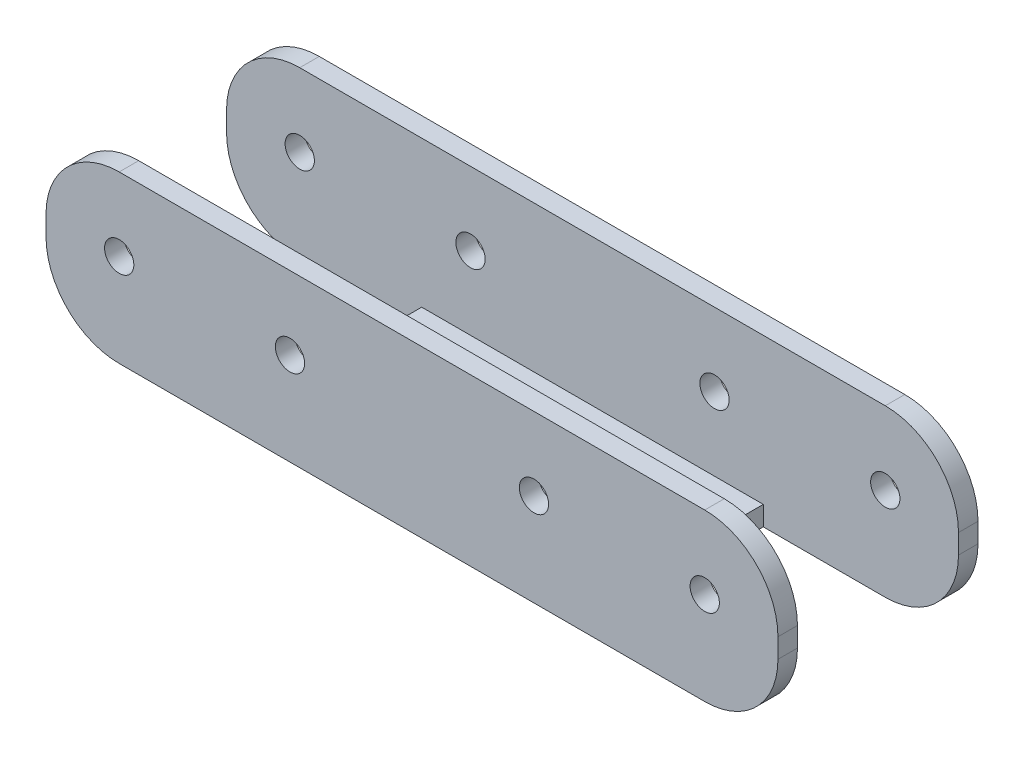
ISO-10303-21;
HEADER;
FILE_DESCRIPTION(('STEP AP214'),'2;1');
FILE_NAME('part.step','',(''),(''),'','','');
FILE_SCHEMA(('AUTOMOTIVE_DESIGN { 1 0 10303 214 1 1 1 1 }'));
ENDSEC;
DATA;
#1=APPLICATION_CONTEXT('core data for automotive mechanical design processes');
#2=APPLICATION_PROTOCOL_DEFINITION('international standard','automotive_design',2000,#1);
#3=PRODUCT_CONTEXT('',#1,'mechanical');
#4=PRODUCT('Part','Part','',(#3));
#5=PRODUCT_RELATED_PRODUCT_CATEGORY('part','',(#4));
#6=PRODUCT_DEFINITION_FORMATION('','',#4);
#7=PRODUCT_DEFINITION_CONTEXT('part definition',#1,'design');
#8=PRODUCT_DEFINITION('design','',#6,#7);
#9=PRODUCT_DEFINITION_SHAPE('','',#8);
#10=(LENGTH_UNIT() NAMED_UNIT(*) SI_UNIT(.MILLI.,.METRE.));
#11=(NAMED_UNIT(*) PLANE_ANGLE_UNIT() SI_UNIT($,.RADIAN.));
#12=(NAMED_UNIT(*) SI_UNIT($,.STERADIAN.) SOLID_ANGLE_UNIT());
#13=UNCERTAINTY_MEASURE_WITH_UNIT(LENGTH_MEASURE(1.E-05),#10,'distance_accuracy_value','');
#14=(GEOMETRIC_REPRESENTATION_CONTEXT(3) GLOBAL_UNCERTAINTY_ASSIGNED_CONTEXT((#13)) GLOBAL_UNIT_ASSIGNED_CONTEXT((#10,
#11,#12)) REPRESENTATION_CONTEXT('',''));
#15=CARTESIAN_POINT('',(0.,0.,0.));
#16=DIRECTION('',(0.,0.,1.));
#17=DIRECTION('',(1.,0.,0.));
#18=AXIS2_PLACEMENT_3D('',#15,#16,#17);
#19=CARTESIAN_POINT('',(0.,0.,0.));
#20=DIRECTION('',(1.,0.,0.));
#21=DIRECTION('',(0.,0.,-1.));
#22=AXIS2_PLACEMENT_3D('',#19,#20,#21);
#23=PLANE('',#22);
#24=DIRECTION('',(0.,-1.,0.));
#25=VECTOR('',#24,1.);
#26=CARTESIAN_POINT('',(0.,0.,-20.5));
#27=LINE('',#26,#25);
#28=CARTESIAN_POINT('',(0.,19.,-20.5));
#29=VERTEX_POINT('',#28);
#30=CARTESIAN_POINT('',(0.,15.,-20.5));
#31=VERTEX_POINT('',#30);
#32=EDGE_CURVE('E269',#29,#31,#27,.T.);
#33=ORIENTED_EDGE('',*,*,#32,.T.);
#34=DIRECTION('',(0.,0.,-1.));
#35=VECTOR('',#34,1.);
#36=CARTESIAN_POINT('',(0.,15.,0.));
#37=LINE('',#36,#35);
#38=CARTESIAN_POINT('',(0.,15.,-16.5));
#39=VERTEX_POINT('',#38);
#40=EDGE_CURVE('E358',#31,#39,#37,.F.);
#41=ORIENTED_EDGE('',*,*,#40,.T.);
#42=DIRECTION('',(0.,1.,0.));
#43=VECTOR('',#42,1.);
#44=CARTESIAN_POINT('',(0.,0.,-16.5));
#45=LINE('',#44,#43);
#46=CARTESIAN_POINT('',(0.,19.,-16.5));
#47=VERTEX_POINT('',#46);
#48=EDGE_CURVE('E255',#39,#47,#45,.T.);
#49=ORIENTED_EDGE('',*,*,#48,.T.);
#50=DIRECTION('',(0.,0.,-1.));
#51=VECTOR('',#50,1.);
#52=CARTESIAN_POINT('',(0.,19.,-20.5));
#53=LINE('',#52,#51);
#54=EDGE_CURVE('E355',#47,#29,#53,.T.);
#55=ORIENTED_EDGE('',*,*,#54,.T.);
#56=EDGE_LOOP('',(#33,#41,#49,#55));
#57=FACE_BOUND('',#56,.T.);
#58=ADVANCED_FACE('F37',(#57),#23,.F.);
#59=CARTESIAN_POINT('',(150.,0.,0.));
#60=DIRECTION('',(1.,0.,0.));
#61=DIRECTION('',(0.,0.,-1.));
#62=AXIS2_PLACEMENT_3D('',#59,#60,#61);
#63=PLANE('',#62);
#64=DIRECTION('',(0.,-1.,0.));
#65=VECTOR('',#64,1.);
#66=CARTESIAN_POINT('',(150.,0.,20.5));
#67=LINE('',#66,#65);
#68=CARTESIAN_POINT('',(150.,19.,20.5));
#69=VERTEX_POINT('',#68);
#70=CARTESIAN_POINT('',(150.,15.,20.5));
#71=VERTEX_POINT('',#70);
#72=EDGE_CURVE('E254',#69,#71,#67,.T.);
#73=ORIENTED_EDGE('',*,*,#72,.T.);
#74=DIRECTION('',(0.,0.,-1.));
#75=VECTOR('',#74,1.);
#76=CARTESIAN_POINT('',(150.,15.,16.5));
#77=LINE('',#76,#75);
#78=CARTESIAN_POINT('',(150.,15.,16.5));
#79=VERTEX_POINT('',#78);
#80=EDGE_CURVE('E299',#71,#79,#77,.T.);
#81=ORIENTED_EDGE('',*,*,#80,.T.);
#82=DIRECTION('',(0.,1.,0.));
#83=VECTOR('',#82,1.);
#84=CARTESIAN_POINT('',(150.,0.,16.5));
#85=LINE('',#84,#83);
#86=CARTESIAN_POINT('',(150.,19.,16.5));
#87=VERTEX_POINT('',#86);
#88=EDGE_CURVE('E251',#79,#87,#85,.T.);
#89=ORIENTED_EDGE('',*,*,#88,.T.);
#90=DIRECTION('',(0.,0.,1.));
#91=VECTOR('',#90,1.);
#92=CARTESIAN_POINT('',(150.,19.,20.5));
#93=LINE('',#92,#91);
#94=EDGE_CURVE('E292',#87,#69,#93,.T.);
#95=ORIENTED_EDGE('',*,*,#94,.T.);
#96=EDGE_LOOP('',(#73,#81,#89,#95));
#97=FACE_BOUND('',#96,.T.);
#98=ADVANCED_FACE('F420',(#97),#63,.T.);
#99=CARTESIAN_POINT('',(150.,4.,0.));
#100=DIRECTION('',(0.,-1.,0.));
#101=DIRECTION('',(0.,0.,-1.));
#102=AXIS2_PLACEMENT_3D('',#99,#100,#101);
#103=PLANE('',#102);
#104=DIRECTION('',(-1.,0.,0.));
#105=VECTOR('',#104,1.);
#106=CARTESIAN_POINT('',(150.,4.,-16.5));
#107=LINE('',#106,#105);
#108=CARTESIAN_POINT('',(110.,4.,-16.5));
#109=VERTEX_POINT('',#108);
#110=CARTESIAN_POINT('',(40.,4.,-16.5));
#111=VERTEX_POINT('',#110);
#112=EDGE_CURVE('E263',#109,#111,#107,.T.);
#113=ORIENTED_EDGE('',*,*,#112,.T.);
#114=DIRECTION('',(0.,0.,1.));
#115=VECTOR('',#114,1.);
#116=CARTESIAN_POINT('',(40.,4.,0.));
#117=LINE('',#116,#115);
#118=CARTESIAN_POINT('',(40.,3.99999999999999,16.5));
#119=VERTEX_POINT('',#118);
#120=EDGE_CURVE('E211',#111,#119,#117,.T.);
#121=ORIENTED_EDGE('',*,*,#120,.T.);
#122=DIRECTION('',(-1.,0.,0.));
#123=VECTOR('',#122,1.);
#124=CARTESIAN_POINT('',(150.,3.99999999999999,16.5));
#125=LINE('',#124,#123);
#126=CARTESIAN_POINT('',(110.,3.99999999999999,16.5));
#127=VERTEX_POINT('',#126);
#128=EDGE_CURVE('E186',#127,#119,#125,.T.);
#129=ORIENTED_EDGE('',*,*,#128,.F.);
#130=DIRECTION('',(0.,0.,-1.));
#131=VECTOR('',#130,1.);
#132=CARTESIAN_POINT('',(110.,4.,0.));
#133=LINE('',#132,#131);
#134=EDGE_CURVE('E225',#127,#109,#133,.T.);
#135=ORIENTED_EDGE('',*,*,#134,.T.);
#136=EDGE_LOOP('',(#113,#121,#129,#135));
#137=FACE_BOUND('',#136,.T.);
#138=ADVANCED_FACE('F425',(#137),#103,.F.);
#139=CARTESIAN_POINT('',(150.,0.,16.5));
#140=DIRECTION('',(0.,0.,1.));
#141=DIRECTION('',(0.,-1.,0.));
#142=AXIS2_PLACEMENT_3D('',#139,#140,#141);
#143=PLANE('',#142);
#144=CARTESIAN_POINT('',(100.,19.,16.5));
#145=DIRECTION('',(0.,0.,1.));
#146=DIRECTION('',(0.,-1.,0.));
#147=AXIS2_PLACEMENT_3D('',#144,#145,#146);
#148=CIRCLE('',#147,3.00000000000001);
#149=CARTESIAN_POINT('',(100.,16.,16.5));
#150=VERTEX_POINT('',#149);
#151=EDGE_CURVE('E372',#150,#150,#148,.T.);
#152=ORIENTED_EDGE('',*,*,#151,.T.);
#153=EDGE_LOOP('',(#152));
#154=FACE_BOUND('',#153,.T.);
#155=CARTESIAN_POINT('',(50.,19.,16.5));
#156=DIRECTION('',(0.,0.,1.));
#157=DIRECTION('',(0.,-1.,0.));
#158=AXIS2_PLACEMENT_3D('',#155,#156,#157);
#159=CIRCLE('',#158,3.);
#160=CARTESIAN_POINT('',(50.,16.,16.5));
#161=VERTEX_POINT('',#160);
#162=EDGE_CURVE('E199',#161,#161,#159,.T.);
#163=ORIENTED_EDGE('',*,*,#162,.T.);
#164=EDGE_LOOP('',(#163));
#165=FACE_BOUND('',#164,.T.);
#166=ORIENTED_EDGE('',*,*,#88,.F.);
#167=CARTESIAN_POINT('',(135.,15.,16.5));
#168=DIRECTION('',(0.,0.,1.));
#169=DIRECTION('',(0.,-1.,0.));
#170=AXIS2_PLACEMENT_3D('',#167,#168,#169);
#171=CIRCLE('',#170,15.);
#172=CARTESIAN_POINT('',(135.,0.,16.5));
#173=VERTEX_POINT('',#172);
#174=EDGE_CURVE('E308',#79,#173,#171,.F.);
#175=ORIENTED_EDGE('',*,*,#174,.T.);
#176=DIRECTION('',(-1.,0.,0.));
#177=VECTOR('',#176,1.);
#178=CARTESIAN_POINT('',(110.,0.,16.5));
#179=LINE('',#178,#177);
#180=CARTESIAN_POINT('',(110.,0.,16.5));
#181=VERTEX_POINT('',#180);
#182=EDGE_CURVE('E214',#173,#181,#179,.T.);
#183=ORIENTED_EDGE('',*,*,#182,.T.);
#184=DIRECTION('',(0.,-1.,0.));
#185=VECTOR('',#184,1.);
#186=CARTESIAN_POINT('',(110.,10.,16.5));
#187=LINE('',#186,#185);
#188=EDGE_CURVE('E222',#127,#181,#187,.T.);
#189=ORIENTED_EDGE('',*,*,#188,.F.);
#190=ORIENTED_EDGE('',*,*,#128,.T.);
#191=DIRECTION('',(0.,-1.,0.));
#192=VECTOR('',#191,1.);
#193=CARTESIAN_POINT('',(40.,10.,16.5));
#194=LINE('',#193,#192);
#195=CARTESIAN_POINT('',(40.,0.,16.5));
#196=VERTEX_POINT('',#195);
#197=EDGE_CURVE('E177',#119,#196,#194,.T.);
#198=ORIENTED_EDGE('',*,*,#197,.T.);
#199=DIRECTION('',(-1.,0.,0.));
#200=VECTOR('',#199,1.);
#201=CARTESIAN_POINT('',(40.,0.,16.5));
#202=LINE('',#201,#200);
#203=CARTESIAN_POINT('',(15.,0.,16.5));
#204=VERTEX_POINT('',#203);
#205=EDGE_CURVE('E183',#196,#204,#202,.T.);
#206=ORIENTED_EDGE('',*,*,#205,.T.);
#207=CARTESIAN_POINT('',(15.,15.,16.5));
#208=DIRECTION('',(0.,0.,1.));
#209=DIRECTION('',(0.,-1.,0.));
#210=AXIS2_PLACEMENT_3D('',#207,#208,#209);
#211=CIRCLE('',#210,15.);
#212=CARTESIAN_POINT('',(0.,15.,16.5));
#213=VERTEX_POINT('',#212);
#214=EDGE_CURVE('E304',#204,#213,#211,.F.);
#215=ORIENTED_EDGE('',*,*,#214,.T.);
#216=DIRECTION('',(0.,1.,0.));
#217=VECTOR('',#216,1.);
#218=CARTESIAN_POINT('',(0.,0.,16.5));
#219=LINE('',#218,#217);
#220=CARTESIAN_POINT('',(0.,19.,16.5));
#221=VERTEX_POINT('',#220);
#222=EDGE_CURVE('E250',#213,#221,#219,.T.);
#223=ORIENTED_EDGE('',*,*,#222,.T.);
#224=CARTESIAN_POINT('',(15.,19.,16.5));
#225=DIRECTION('',(0.,0.,1.));
#226=DIRECTION('',(0.,-1.,0.));
#227=AXIS2_PLACEMENT_3D('',#224,#225,#226);
#228=CIRCLE('',#227,15.);
#229=CARTESIAN_POINT('',(15.,34.,16.5));
#230=VERTEX_POINT('',#229);
#231=EDGE_CURVE('E302',#221,#230,#228,.F.);
#232=ORIENTED_EDGE('',*,*,#231,.T.);
#233=DIRECTION('',(-1.,0.,0.));
#234=VECTOR('',#233,1.);
#235=CARTESIAN_POINT('',(150.,34.,16.5));
#236=LINE('',#235,#234);
#237=CARTESIAN_POINT('',(135.,34.,16.5));
#238=VERTEX_POINT('',#237);
#239=EDGE_CURVE('E288',#238,#230,#236,.T.);
#240=ORIENTED_EDGE('',*,*,#239,.F.);
#241=CARTESIAN_POINT('',(135.,19.,16.5));
#242=DIRECTION('',(0.,0.,1.));
#243=DIRECTION('',(0.,-1.,0.));
#244=AXIS2_PLACEMENT_3D('',#241,#242,#243);
#245=CIRCLE('',#244,15.);
#246=EDGE_CURVE('E306',#238,#87,#245,.F.);
#247=ORIENTED_EDGE('',*,*,#246,.T.);
#248=EDGE_LOOP('',(#166,#175,#183,#189,#190,#198,#206,#215,#223,#232,#240,#247));
#249=FACE_BOUND('',#248,.T.);
#250=CARTESIAN_POINT('',(135.,19.,16.5));
#251=DIRECTION('',(0.,0.,1.));
#252=DIRECTION('',(0.,-1.,0.));
#253=AXIS2_PLACEMENT_3D('',#250,#251,#252);
#254=CIRCLE('',#253,2.99999999999999);
#255=CARTESIAN_POINT('',(135.,16.,16.5));
#256=VERTEX_POINT('',#255);
#257=EDGE_CURVE('E237',#256,#256,#254,.T.);
#258=ORIENTED_EDGE('',*,*,#257,.T.);
#259=EDGE_LOOP('',(#258));
#260=FACE_BOUND('',#259,.T.);
#261=CARTESIAN_POINT('',(15.,19.,16.5));
#262=DIRECTION('',(0.,0.,1.));
#263=DIRECTION('',(0.,-1.,0.));
#264=AXIS2_PLACEMENT_3D('',#261,#262,#263);
#265=CIRCLE('',#264,2.99999999999999);
#266=CARTESIAN_POINT('',(15.,16.,16.5));
#267=VERTEX_POINT('',#266);
#268=EDGE_CURVE('E247',#267,#267,#265,.T.);
#269=ORIENTED_EDGE('',*,*,#268,.T.);
#270=EDGE_LOOP('',(#269));
#271=FACE_BOUND('',#270,.T.);
#272=ADVANCED_FACE('F180',(#154,#165,#249,#260,#271),#143,.F.);
#273=CARTESIAN_POINT('',(150.,34.,0.));
#274=DIRECTION('',(0.,-1.,0.));
#275=DIRECTION('',(0.,0.,-1.));
#276=AXIS2_PLACEMENT_3D('',#273,#274,#275);
#277=PLANE('',#276);
#278=DIRECTION('',(-1.,0.,0.));
#279=VECTOR('',#278,1.);
#280=CARTESIAN_POINT('',(150.,34.,20.5));
#281=LINE('',#280,#279);
#282=CARTESIAN_POINT('',(135.,34.,20.5));
#283=VERTEX_POINT('',#282);
#284=CARTESIAN_POINT('',(15.,34.,20.5));
#285=VERTEX_POINT('',#284);
#286=EDGE_CURVE('E285',#283,#285,#281,.T.);
#287=ORIENTED_EDGE('',*,*,#286,.F.);
#288=DIRECTION('',(0.,0.,1.));
#289=VECTOR('',#288,1.);
#290=CARTESIAN_POINT('',(135.,34.,16.5));
#291=LINE('',#290,#289);
#292=EDGE_CURVE('E353',#283,#238,#291,.F.);
#293=ORIENTED_EDGE('',*,*,#292,.T.);
#294=ORIENTED_EDGE('',*,*,#239,.T.);
#295=DIRECTION('',(0.,0.,1.));
#296=VECTOR('',#295,1.);
#297=CARTESIAN_POINT('',(15.,34.,0.));
#298=LINE('',#297,#296);
#299=EDGE_CURVE('E350',#230,#285,#298,.T.);
#300=ORIENTED_EDGE('',*,*,#299,.T.);
#301=EDGE_LOOP('',(#287,#293,#294,#300));
#302=FACE_BOUND('',#301,.T.);
#303=ADVANCED_FACE('F438',(#302),#277,.F.);
#304=CARTESIAN_POINT('',(150.,0.,20.5));
#305=DIRECTION('',(0.,0.,-1.));
#306=DIRECTION('',(0.,1.,0.));
#307=AXIS2_PLACEMENT_3D('',#304,#305,#306);
#308=PLANE('',#307);
#309=CARTESIAN_POINT('',(100.,19.,20.5));
#310=DIRECTION('',(0.,0.,1.));
#311=DIRECTION('',(1.,0.,0.));
#312=AXIS2_PLACEMENT_3D('',#309,#310,#311);
#313=CIRCLE('',#312,3.00000000000001);
#314=CARTESIAN_POINT('',(103.,19.,20.5));
#315=VERTEX_POINT('',#314);
#316=EDGE_CURVE('E377',#315,#315,#313,.T.);
#317=ORIENTED_EDGE('',*,*,#316,.F.);
#318=EDGE_LOOP('',(#317));
#319=FACE_BOUND('',#318,.T.);
#320=CARTESIAN_POINT('',(50.,19.,20.5));
#321=DIRECTION('',(0.,0.,1.));
#322=DIRECTION('',(1.,0.,0.));
#323=AXIS2_PLACEMENT_3D('',#320,#321,#322);
#324=CIRCLE('',#323,3.);
#325=CARTESIAN_POINT('',(53.,19.,20.5));
#326=VERTEX_POINT('',#325);
#327=EDGE_CURVE('E367',#326,#326,#324,.T.);
#328=ORIENTED_EDGE('',*,*,#327,.F.);
#329=EDGE_LOOP('',(#328));
#330=FACE_BOUND('',#329,.T.);
#331=CARTESIAN_POINT('',(135.,19.,20.5));
#332=DIRECTION('',(0.,0.,1.));
#333=DIRECTION('',(-1.,0.,0.));
#334=AXIS2_PLACEMENT_3D('',#331,#332,#333);
#335=CIRCLE('',#334,2.99999999999999);
#336=CARTESIAN_POINT('',(132.,19.,20.5));
#337=VERTEX_POINT('',#336);
#338=EDGE_CURVE('E230',#337,#337,#335,.T.);
#339=ORIENTED_EDGE('',*,*,#338,.F.);
#340=EDGE_LOOP('',(#339));
#341=FACE_BOUND('',#340,.T.);
#342=CARTESIAN_POINT('',(15.,19.,20.5));
#343=DIRECTION('',(0.,0.,1.));
#344=DIRECTION('',(1.,0.,0.));
#345=AXIS2_PLACEMENT_3D('',#342,#343,#344);
#346=CIRCLE('',#345,2.99999999999999);
#347=CARTESIAN_POINT('',(18.,19.,20.5));
#348=VERTEX_POINT('',#347);
#349=EDGE_CURVE('E240',#348,#348,#346,.T.);
#350=ORIENTED_EDGE('',*,*,#349,.F.);
#351=EDGE_LOOP('',(#350));
#352=FACE_BOUND('',#351,.T.);
#353=DIRECTION('',(-1.,0.,0.));
#354=VECTOR('',#353,1.);
#355=CARTESIAN_POINT('',(150.,0.,20.5));
#356=LINE('',#355,#354);
#357=CARTESIAN_POINT('',(135.,0.,20.5));
#358=VERTEX_POINT('',#357);
#359=CARTESIAN_POINT('',(15.,0.,20.5));
#360=VERTEX_POINT('',#359);
#361=EDGE_CURVE('E283',#358,#360,#356,.T.);
#362=ORIENTED_EDGE('',*,*,#361,.F.);
#363=CARTESIAN_POINT('',(135.,15.,20.5));
#364=DIRECTION('',(0.,0.,-1.));
#365=DIRECTION('',(0.,1.,0.));
#366=AXIS2_PLACEMENT_3D('',#363,#364,#365);
#367=CIRCLE('',#366,15.);
#368=EDGE_CURVE('E324',#358,#71,#367,.F.);
#369=ORIENTED_EDGE('',*,*,#368,.T.);
#370=ORIENTED_EDGE('',*,*,#72,.F.);
#371=CARTESIAN_POINT('',(135.,19.,20.5));
#372=DIRECTION('',(0.,0.,-1.));
#373=DIRECTION('',(0.,1.,0.));
#374=AXIS2_PLACEMENT_3D('',#371,#372,#373);
#375=CIRCLE('',#374,15.);
#376=EDGE_CURVE('E322',#69,#283,#375,.F.);
#377=ORIENTED_EDGE('',*,*,#376,.T.);
#378=ORIENTED_EDGE('',*,*,#286,.T.);
#379=CARTESIAN_POINT('',(15.,19.,20.5));
#380=DIRECTION('',(0.,0.,-1.));
#381=DIRECTION('',(0.,1.,0.));
#382=AXIS2_PLACEMENT_3D('',#379,#380,#381);
#383=CIRCLE('',#382,15.);
#384=CARTESIAN_POINT('',(0.,19.,20.5));
#385=VERTEX_POINT('',#384);
#386=EDGE_CURVE('E318',#285,#385,#383,.F.);
#387=ORIENTED_EDGE('',*,*,#386,.T.);
#388=DIRECTION('',(0.,-1.,0.));
#389=VECTOR('',#388,1.);
#390=CARTESIAN_POINT('',(0.,0.,20.5));
#391=LINE('',#390,#389);
#392=CARTESIAN_POINT('',(0.,15.,20.5));
#393=VERTEX_POINT('',#392);
#394=EDGE_CURVE('E266',#385,#393,#391,.T.);
#395=ORIENTED_EDGE('',*,*,#394,.T.);
#396=CARTESIAN_POINT('',(15.,15.,20.5));
#397=DIRECTION('',(0.,0.,-1.));
#398=DIRECTION('',(0.,1.,0.));
#399=AXIS2_PLACEMENT_3D('',#396,#397,#398);
#400=CIRCLE('',#399,15.);
#401=EDGE_CURVE('E320',#393,#360,#400,.F.);
#402=ORIENTED_EDGE('',*,*,#401,.T.);
#403=EDGE_LOOP('',(#362,#369,#370,#377,#378,#387,#395,#402));
#404=FACE_BOUND('',#403,.T.);
#405=ADVANCED_FACE('F435',(#319,#330,#341,#352,#404),#308,.F.);
#406=CARTESIAN_POINT('',(150.,0.,0.));
#407=DIRECTION('',(0.,1.,0.));
#408=DIRECTION('',(0.,0.,1.));
#409=AXIS2_PLACEMENT_3D('',#406,#407,#408);
#410=PLANE('',#409);
#411=ORIENTED_EDGE('',*,*,#182,.F.);
#412=DIRECTION('',(0.,0.,-1.));
#413=VECTOR('',#412,1.);
#414=CARTESIAN_POINT('',(135.,0.,20.5));
#415=LINE('',#414,#413);
#416=EDGE_CURVE('E316',#173,#358,#415,.F.);
#417=ORIENTED_EDGE('',*,*,#416,.T.);
#418=ORIENTED_EDGE('',*,*,#361,.T.);
#419=DIRECTION('',(0.,0.,-1.));
#420=VECTOR('',#419,1.);
#421=CARTESIAN_POINT('',(15.,0.,0.));
#422=LINE('',#421,#420);
#423=EDGE_CURVE('E206',#360,#204,#422,.T.);
#424=ORIENTED_EDGE('',*,*,#423,.T.);
#425=ORIENTED_EDGE('',*,*,#205,.F.);
#426=DIRECTION('',(0.,0.,1.));
#427=VECTOR('',#426,1.);
#428=CARTESIAN_POINT('',(40.,0.,-16.5));
#429=LINE('',#428,#427);
#430=CARTESIAN_POINT('',(40.,0.,-16.5));
#431=VERTEX_POINT('',#430);
#432=EDGE_CURVE('E194',#431,#196,#429,.T.);
#433=ORIENTED_EDGE('',*,*,#432,.F.);
#434=DIRECTION('',(1.,0.,0.));
#435=VECTOR('',#434,1.);
#436=CARTESIAN_POINT('',(0.,0.,-16.5));
#437=LINE('',#436,#435);
#438=CARTESIAN_POINT('',(15.,0.,-16.5));
#439=VERTEX_POINT('',#438);
#440=EDGE_CURVE('E190',#439,#431,#437,.T.);
#441=ORIENTED_EDGE('',*,*,#440,.F.);
#442=DIRECTION('',(0.,0.,-1.));
#443=VECTOR('',#442,1.);
#444=CARTESIAN_POINT('',(15.,0.,0.));
#445=LINE('',#444,#443);
#446=CARTESIAN_POINT('',(15.,0.,-20.5));
#447=VERTEX_POINT('',#446);
#448=EDGE_CURVE('E311',#439,#447,#445,.T.);
#449=ORIENTED_EDGE('',*,*,#448,.T.);
#450=DIRECTION('',(-1.,0.,0.));
#451=VECTOR('',#450,1.);
#452=CARTESIAN_POINT('',(150.,0.,-20.5));
#453=LINE('',#452,#451);
#454=CARTESIAN_POINT('',(135.,0.,-20.5));
#455=VERTEX_POINT('',#454);
#456=EDGE_CURVE('E280',#455,#447,#453,.T.);
#457=ORIENTED_EDGE('',*,*,#456,.F.);
#458=DIRECTION('',(0.,0.,-1.));
#459=VECTOR('',#458,1.);
#460=CARTESIAN_POINT('',(135.,0.,-16.5));
#461=LINE('',#460,#459);
#462=CARTESIAN_POINT('',(135.,0.,-16.5));
#463=VERTEX_POINT('',#462);
#464=EDGE_CURVE('E314',#455,#463,#461,.F.);
#465=ORIENTED_EDGE('',*,*,#464,.T.);
#466=DIRECTION('',(1.,0.,0.));
#467=VECTOR('',#466,1.);
#468=CARTESIAN_POINT('',(150.,0.,-16.5));
#469=LINE('',#468,#467);
#470=CARTESIAN_POINT('',(110.,0.,-16.5));
#471=VERTEX_POINT('',#470);
#472=EDGE_CURVE('E219',#471,#463,#469,.T.);
#473=ORIENTED_EDGE('',*,*,#472,.F.);
#474=DIRECTION('',(0.,0.,-1.));
#475=VECTOR('',#474,1.);
#476=CARTESIAN_POINT('',(110.,0.,-16.5));
#477=LINE('',#476,#475);
#478=EDGE_CURVE('E216',#181,#471,#477,.T.);
#479=ORIENTED_EDGE('',*,*,#478,.F.);
#480=EDGE_LOOP('',(#411,#417,#418,#424,#425,#433,#441,#449,#457,#465,#473,#479));
#481=FACE_BOUND('',#480,.T.);
#482=ADVANCED_FACE('F203',(#481),#410,.F.);
#483=CARTESIAN_POINT('',(150.,0.,-20.5));
#484=DIRECTION('',(0.,0.,-1.));
#485=DIRECTION('',(0.,1.,0.));
#486=AXIS2_PLACEMENT_3D('',#483,#484,#485);
#487=PLANE('',#486);
#488=CARTESIAN_POINT('',(100.,19.,-20.5));
#489=DIRECTION('',(0.,0.,1.));
#490=DIRECTION('',(1.,0.,0.));
#491=AXIS2_PLACEMENT_3D('',#488,#489,#490);
#492=CIRCLE('',#491,3.00000000000001);
#493=CARTESIAN_POINT('',(103.,19.,-20.5));
#494=VERTEX_POINT('',#493);
#495=EDGE_CURVE('E380',#494,#494,#492,.T.);
#496=ORIENTED_EDGE('',*,*,#495,.T.);
#497=EDGE_LOOP('',(#496));
#498=FACE_BOUND('',#497,.T.);
#499=CARTESIAN_POINT('',(50.,19.,-20.5));
#500=DIRECTION('',(0.,0.,1.));
#501=DIRECTION('',(1.,0.,0.));
#502=AXIS2_PLACEMENT_3D('',#499,#500,#501);
#503=CIRCLE('',#502,3.);
#504=CARTESIAN_POINT('',(53.,19.,-20.5));
#505=VERTEX_POINT('',#504);
#506=EDGE_CURVE('E362',#505,#505,#503,.T.);
#507=ORIENTED_EDGE('',*,*,#506,.T.);
#508=EDGE_LOOP('',(#507));
#509=FACE_BOUND('',#508,.T.);
#510=CARTESIAN_POINT('',(135.,19.,-20.5));
#511=DIRECTION('',(0.,0.,-1.));
#512=DIRECTION('',(0.,1.,0.));
#513=AXIS2_PLACEMENT_3D('',#510,#511,#512);
#514=CIRCLE('',#513,2.99999999999999);
#515=CARTESIAN_POINT('',(135.,22.,-20.5));
#516=VERTEX_POINT('',#515);
#517=EDGE_CURVE('E234',#516,#516,#514,.T.);
#518=ORIENTED_EDGE('',*,*,#517,.F.);
#519=EDGE_LOOP('',(#518));
#520=FACE_BOUND('',#519,.T.);
#521=CARTESIAN_POINT('',(15.,19.,-20.5));
#522=DIRECTION('',(0.,0.,-1.));
#523=DIRECTION('',(0.,1.,0.));
#524=AXIS2_PLACEMENT_3D('',#521,#522,#523);
#525=CIRCLE('',#524,2.99999999999999);
#526=CARTESIAN_POINT('',(15.,22.,-20.5));
#527=VERTEX_POINT('',#526);
#528=EDGE_CURVE('E244',#527,#527,#525,.T.);
#529=ORIENTED_EDGE('',*,*,#528,.F.);
#530=EDGE_LOOP('',(#529));
#531=FACE_BOUND('',#530,.T.);
#532=DIRECTION('',(0.,-1.,0.));
#533=VECTOR('',#532,1.);
#534=CARTESIAN_POINT('',(150.,0.,-20.5));
#535=LINE('',#534,#533);
#536=CARTESIAN_POINT('',(150.,19.,-20.5));
#537=VERTEX_POINT('',#536);
#538=CARTESIAN_POINT('',(150.,15.,-20.5));
#539=VERTEX_POINT('',#538);
#540=EDGE_CURVE('E258',#537,#539,#535,.T.);
#541=ORIENTED_EDGE('',*,*,#540,.T.);
#542=CARTESIAN_POINT('',(135.,15.,-20.5));
#543=DIRECTION('',(0.,0.,-1.));
#544=DIRECTION('',(0.,1.,0.));
#545=AXIS2_PLACEMENT_3D('',#542,#543,#544);
#546=CIRCLE('',#545,15.);
#547=EDGE_CURVE('E337',#539,#455,#546,.T.);
#548=ORIENTED_EDGE('',*,*,#547,.T.);
#549=ORIENTED_EDGE('',*,*,#456,.T.);
#550=CARTESIAN_POINT('',(15.,15.,-20.5));
#551=DIRECTION('',(0.,0.,-1.));
#552=DIRECTION('',(0.,1.,0.));
#553=AXIS2_PLACEMENT_3D('',#550,#551,#552);
#554=CIRCLE('',#553,15.);
#555=EDGE_CURVE('E333',#447,#31,#554,.T.);
#556=ORIENTED_EDGE('',*,*,#555,.T.);
#557=ORIENTED_EDGE('',*,*,#32,.F.);
#558=CARTESIAN_POINT('',(15.,19.,-20.5));
#559=DIRECTION('',(0.,0.,-1.));
#560=DIRECTION('',(0.,1.,0.));
#561=AXIS2_PLACEMENT_3D('',#558,#559,#560);
#562=CIRCLE('',#561,15.);
#563=CARTESIAN_POINT('',(15.,34.,-20.5));
#564=VERTEX_POINT('',#563);
#565=EDGE_CURVE('E331',#29,#564,#562,.T.);
#566=ORIENTED_EDGE('',*,*,#565,.T.);
#567=DIRECTION('',(-1.,0.,0.));
#568=VECTOR('',#567,1.);
#569=CARTESIAN_POINT('',(150.,34.,-20.5));
#570=LINE('',#569,#568);
#571=CARTESIAN_POINT('',(135.,34.,-20.5));
#572=VERTEX_POINT('',#571);
#573=EDGE_CURVE('E278',#572,#564,#570,.T.);
#574=ORIENTED_EDGE('',*,*,#573,.F.);
#575=CARTESIAN_POINT('',(135.,19.,-20.5));
#576=DIRECTION('',(0.,0.,-1.));
#577=DIRECTION('',(0.,1.,0.));
#578=AXIS2_PLACEMENT_3D('',#575,#576,#577);
#579=CIRCLE('',#578,15.);
#580=EDGE_CURVE('E335',#572,#537,#579,.T.);
#581=ORIENTED_EDGE('',*,*,#580,.T.);
#582=EDGE_LOOP('',(#541,#548,#549,#556,#557,#566,#574,#581));
#583=FACE_BOUND('',#582,.T.);
#584=ADVANCED_FACE('F430',(#498,#509,#520,#531,#583),#487,.T.);
#585=CARTESIAN_POINT('',(150.,34.,0.));
#586=DIRECTION('',(0.,1.,0.));
#587=DIRECTION('',(0.,0.,1.));
#588=AXIS2_PLACEMENT_3D('',#585,#586,#587);
#589=PLANE('',#588);
#590=DIRECTION('',(-1.,0.,0.));
#591=VECTOR('',#590,1.);
#592=CARTESIAN_POINT('',(150.,34.,-16.5));
#593=LINE('',#592,#591);
#594=CARTESIAN_POINT('',(135.,34.,-16.5));
#595=VERTEX_POINT('',#594);
#596=CARTESIAN_POINT('',(15.,34.,-16.5));
#597=VERTEX_POINT('',#596);
#598=EDGE_CURVE('E276',#595,#597,#593,.T.);
#599=ORIENTED_EDGE('',*,*,#598,.F.);
#600=DIRECTION('',(0.,0.,-1.));
#601=VECTOR('',#600,1.);
#602=CARTESIAN_POINT('',(135.,34.,0.));
#603=LINE('',#602,#601);
#604=EDGE_CURVE('E347',#595,#572,#603,.T.);
#605=ORIENTED_EDGE('',*,*,#604,.T.);
#606=ORIENTED_EDGE('',*,*,#573,.T.);
#607=DIRECTION('',(0.,0.,-1.));
#608=VECTOR('',#607,1.);
#609=CARTESIAN_POINT('',(15.,34.,-16.5));
#610=LINE('',#609,#608);
#611=EDGE_CURVE('E54',#564,#597,#610,.F.);
#612=ORIENTED_EDGE('',*,*,#611,.T.);
#613=EDGE_LOOP('',(#599,#605,#606,#612));
#614=FACE_BOUND('',#613,.T.);
#615=ADVANCED_FACE('F394',(#614),#589,.T.);
#616=CARTESIAN_POINT('',(150.,0.,-16.5));
#617=DIRECTION('',(0.,0.,1.));
#618=DIRECTION('',(0.,-1.,0.));
#619=AXIS2_PLACEMENT_3D('',#616,#617,#618);
#620=PLANE('',#619);
#621=CARTESIAN_POINT('',(100.,19.,-16.5));
#622=DIRECTION('',(0.,0.,1.));
#623=DIRECTION('',(0.,-1.,0.));
#624=AXIS2_PLACEMENT_3D('',#621,#622,#623);
#625=CIRCLE('',#624,3.00000000000001);
#626=CARTESIAN_POINT('',(100.,16.,-16.5));
#627=VERTEX_POINT('',#626);
#628=EDGE_CURVE('E41',#627,#627,#625,.T.);
#629=ORIENTED_EDGE('',*,*,#628,.F.);
#630=EDGE_LOOP('',(#629));
#631=FACE_BOUND('',#630,.T.);
#632=CARTESIAN_POINT('',(50.,19.,-16.5));
#633=DIRECTION('',(0.,0.,1.));
#634=DIRECTION('',(0.,-1.,0.));
#635=AXIS2_PLACEMENT_3D('',#632,#633,#634);
#636=CIRCLE('',#635,3.);
#637=CARTESIAN_POINT('',(50.,16.,-16.5));
#638=VERTEX_POINT('',#637);
#639=EDGE_CURVE('E360',#638,#638,#636,.T.);
#640=ORIENTED_EDGE('',*,*,#639,.F.);
#641=EDGE_LOOP('',(#640));
#642=FACE_BOUND('',#641,.T.);
#643=ORIENTED_EDGE('',*,*,#472,.T.);
#644=CARTESIAN_POINT('',(135.,15.,-16.5));
#645=DIRECTION('',(0.,0.,1.));
#646=DIRECTION('',(0.,-1.,0.));
#647=AXIS2_PLACEMENT_3D('',#644,#645,#646);
#648=CIRCLE('',#647,15.);
#649=CARTESIAN_POINT('',(150.,15.,-16.5));
#650=VERTEX_POINT('',#649);
#651=EDGE_CURVE('E344',#463,#650,#648,.T.);
#652=ORIENTED_EDGE('',*,*,#651,.T.);
#653=DIRECTION('',(0.,1.,0.));
#654=VECTOR('',#653,1.);
#655=CARTESIAN_POINT('',(150.,0.,-16.5));
#656=LINE('',#655,#654);
#657=CARTESIAN_POINT('',(150.,19.,-16.5));
#658=VERTEX_POINT('',#657);
#659=EDGE_CURVE('E261',#650,#658,#656,.T.);
#660=ORIENTED_EDGE('',*,*,#659,.T.);
#661=CARTESIAN_POINT('',(135.,19.,-16.5));
#662=DIRECTION('',(0.,0.,1.));
#663=DIRECTION('',(0.,-1.,0.));
#664=AXIS2_PLACEMENT_3D('',#661,#662,#663);
#665=CIRCLE('',#664,15.);
#666=EDGE_CURVE('E61',#658,#595,#665,.T.);
#667=ORIENTED_EDGE('',*,*,#666,.T.);
#668=ORIENTED_EDGE('',*,*,#598,.T.);
#669=CARTESIAN_POINT('',(15.,19.,-16.5));
#670=DIRECTION('',(0.,0.,1.));
#671=DIRECTION('',(0.,-1.,0.));
#672=AXIS2_PLACEMENT_3D('',#669,#670,#671);
#673=CIRCLE('',#672,15.);
#674=EDGE_CURVE('E339',#597,#47,#673,.T.);
#675=ORIENTED_EDGE('',*,*,#674,.T.);
#676=ORIENTED_EDGE('',*,*,#48,.F.);
#677=CARTESIAN_POINT('',(15.,15.,-16.5));
#678=DIRECTION('',(0.,0.,1.));
#679=DIRECTION('',(0.,-1.,0.));
#680=AXIS2_PLACEMENT_3D('',#677,#678,#679);
#681=CIRCLE('',#680,15.);
#682=EDGE_CURVE('E341',#39,#439,#681,.T.);
#683=ORIENTED_EDGE('',*,*,#682,.T.);
#684=ORIENTED_EDGE('',*,*,#440,.T.);
#685=DIRECTION('',(0.,-1.,0.));
#686=VECTOR('',#685,1.);
#687=CARTESIAN_POINT('',(40.,10.,-16.5));
#688=LINE('',#687,#686);
#689=EDGE_CURVE('E189',#111,#431,#688,.T.);
#690=ORIENTED_EDGE('',*,*,#689,.F.);
#691=ORIENTED_EDGE('',*,*,#112,.F.);
#692=DIRECTION('',(0.,-1.,0.));
#693=VECTOR('',#692,1.);
#694=CARTESIAN_POINT('',(110.,10.,-16.5));
#695=LINE('',#694,#693);
#696=EDGE_CURVE('E223',#109,#471,#695,.T.);
#697=ORIENTED_EDGE('',*,*,#696,.T.);
#698=EDGE_LOOP('',(#643,#652,#660,#667,#668,#675,#676,#683,#684,#690,#691,#697));
#699=FACE_BOUND('',#698,.T.);
#700=CARTESIAN_POINT('',(135.,19.,-16.5));
#701=DIRECTION('',(0.,0.,1.));
#702=DIRECTION('',(0.,-1.,0.));
#703=AXIS2_PLACEMENT_3D('',#700,#701,#702);
#704=CIRCLE('',#703,2.99999999999999);
#705=CARTESIAN_POINT('',(135.,16.,-16.5));
#706=VERTEX_POINT('',#705);
#707=EDGE_CURVE('E233',#706,#706,#704,.T.);
#708=ORIENTED_EDGE('',*,*,#707,.F.);
#709=EDGE_LOOP('',(#708));
#710=FACE_BOUND('',#709,.T.);
#711=CARTESIAN_POINT('',(15.,19.,-16.5));
#712=DIRECTION('',(0.,0.,1.));
#713=DIRECTION('',(0.,-1.,0.));
#714=AXIS2_PLACEMENT_3D('',#711,#712,#713);
#715=CIRCLE('',#714,2.99999999999999);
#716=CARTESIAN_POINT('',(15.,16.,-16.5));
#717=VERTEX_POINT('',#716);
#718=EDGE_CURVE('E243',#717,#717,#715,.T.);
#719=ORIENTED_EDGE('',*,*,#718,.F.);
#720=EDGE_LOOP('',(#719));
#721=FACE_BOUND('',#720,.T.);
#722=ADVANCED_FACE('F390',(#631,#642,#699,#710,#721),#620,.T.);
#723=ORIENTED_EDGE('',*,*,#659,.F.);
#724=DIRECTION('',(0.,0.,-1.));
#725=VECTOR('',#724,1.);
#726=CARTESIAN_POINT('',(150.,15.,-20.5));
#727=LINE('',#726,#725);
#728=EDGE_CURVE('E328',#650,#539,#727,.T.);
#729=ORIENTED_EDGE('',*,*,#728,.T.);
#730=ORIENTED_EDGE('',*,*,#540,.F.);
#731=DIRECTION('',(0.,0.,-1.));
#732=VECTOR('',#731,1.);
#733=CARTESIAN_POINT('',(150.,19.,0.));
#734=LINE('',#733,#732);
#735=EDGE_CURVE('E326',#537,#658,#734,.F.);
#736=ORIENTED_EDGE('',*,*,#735,.T.);
#737=EDGE_LOOP('',(#723,#729,#730,#736));
#738=FACE_BOUND('',#737,.T.);
#739=ADVANCED_FACE('F393',(#738),#63,.T.);
#740=ORIENTED_EDGE('',*,*,#222,.F.);
#741=DIRECTION('',(0.,0.,-1.));
#742=VECTOR('',#741,1.);
#743=CARTESIAN_POINT('',(0.,15.,0.));
#744=LINE('',#743,#742);
#745=EDGE_CURVE('E11',#213,#393,#744,.F.);
#746=ORIENTED_EDGE('',*,*,#745,.T.);
#747=ORIENTED_EDGE('',*,*,#394,.F.);
#748=DIRECTION('',(0.,0.,1.));
#749=VECTOR('',#748,1.);
#750=CARTESIAN_POINT('',(0.,19.,0.));
#751=LINE('',#750,#749);
#752=EDGE_CURVE('E46',#385,#221,#751,.F.);
#753=ORIENTED_EDGE('',*,*,#752,.T.);
#754=EDGE_LOOP('',(#740,#746,#747,#753));
#755=FACE_BOUND('',#754,.T.);
#756=ADVANCED_FACE('F406',(#755),#23,.F.);
#757=CARTESIAN_POINT('',(15.,19.,-279.5));
#758=DIRECTION('',(0.,0.,1.));
#759=DIRECTION('',(1.,0.,0.));
#760=AXIS2_PLACEMENT_3D('',#757,#758,#759);
#761=CYLINDRICAL_SURFACE('',#760,2.99999999999999);
#762=ORIENTED_EDGE('',*,*,#528,.T.);
#763=EDGE_LOOP('',(#762));
#764=FACE_BOUND('',#763,.T.);
#765=ORIENTED_EDGE('',*,*,#718,.T.);
#766=EDGE_LOOP('',(#765));
#767=FACE_BOUND('',#766,.T.);
#768=ADVANCED_FACE('F403',(#764,#767),#761,.F.);
#769=ORIENTED_EDGE('',*,*,#349,.T.);
#770=EDGE_LOOP('',(#769));
#771=FACE_BOUND('',#770,.T.);
#772=ORIENTED_EDGE('',*,*,#268,.F.);
#773=EDGE_LOOP('',(#772));
#774=FACE_BOUND('',#773,.T.);
#775=ADVANCED_FACE('F405',(#771,#774),#761,.F.);
#776=CARTESIAN_POINT('',(135.,19.,-279.5));
#777=DIRECTION('',(0.,0.,1.));
#778=DIRECTION('',(1.,0.,0.));
#779=AXIS2_PLACEMENT_3D('',#776,#777,#778);
#780=CYLINDRICAL_SURFACE('',#779,2.99999999999999);
#781=ORIENTED_EDGE('',*,*,#517,.T.);
#782=EDGE_LOOP('',(#781));
#783=FACE_BOUND('',#782,.T.);
#784=ORIENTED_EDGE('',*,*,#707,.T.);
#785=EDGE_LOOP('',(#784));
#786=FACE_BOUND('',#785,.T.);
#787=ADVANCED_FACE('F413',(#783,#786),#780,.F.);
#788=ORIENTED_EDGE('',*,*,#338,.T.);
#789=EDGE_LOOP('',(#788));
#790=FACE_BOUND('',#789,.T.);
#791=ORIENTED_EDGE('',*,*,#257,.F.);
#792=EDGE_LOOP('',(#791));
#793=FACE_BOUND('',#792,.T.);
#794=ADVANCED_FACE('F628',(#790,#793),#780,.F.);
#795=CARTESIAN_POINT('',(110.,10.,-16.5));
#796=DIRECTION('',(-1.,0.,0.));
#797=DIRECTION('',(0.,0.,1.));
#798=AXIS2_PLACEMENT_3D('',#795,#796,#797);
#799=PLANE('',#798);
#800=ORIENTED_EDGE('',*,*,#188,.T.);
#801=ORIENTED_EDGE('',*,*,#478,.T.);
#802=ORIENTED_EDGE('',*,*,#696,.F.);
#803=ORIENTED_EDGE('',*,*,#134,.F.);
#804=EDGE_LOOP('',(#800,#801,#802,#803));
#805=FACE_BOUND('',#804,.T.);
#806=ADVANCED_FACE('F626',(#805),#799,.F.);
#807=CARTESIAN_POINT('',(40.,10.,-16.5));
#808=DIRECTION('',(1.,0.,0.));
#809=DIRECTION('',(0.,0.,-1.));
#810=AXIS2_PLACEMENT_3D('',#807,#808,#809);
#811=PLANE('',#810);
#812=ORIENTED_EDGE('',*,*,#689,.T.);
#813=ORIENTED_EDGE('',*,*,#432,.T.);
#814=ORIENTED_EDGE('',*,*,#197,.F.);
#815=ORIENTED_EDGE('',*,*,#120,.F.);
#816=EDGE_LOOP('',(#812,#813,#814,#815));
#817=FACE_BOUND('',#816,.T.);
#818=ADVANCED_FACE('F195',(#817),#811,.F.);
#819=CARTESIAN_POINT('',(135.,15.,0.));
#820=DIRECTION('',(0.,0.,1.));
#821=DIRECTION('',(0.,-1.,0.));
#822=AXIS2_PLACEMENT_3D('',#819,#820,#821);
#823=CYLINDRICAL_SURFACE('',#822,15.);
#824=ORIENTED_EDGE('',*,*,#368,.F.);
#825=ORIENTED_EDGE('',*,*,#416,.F.);
#826=ORIENTED_EDGE('',*,*,#174,.F.);
#827=ORIENTED_EDGE('',*,*,#80,.F.);
#828=EDGE_LOOP('',(#824,#825,#826,#827));
#829=FACE_BOUND('',#828,.T.);
#830=ADVANCED_FACE('F449',(#829),#823,.T.);
#831=CARTESIAN_POINT('',(135.,15.,0.));
#832=DIRECTION('',(0.,0.,1.));
#833=DIRECTION('',(0.,-1.,0.));
#834=AXIS2_PLACEMENT_3D('',#831,#832,#833);
#835=CYLINDRICAL_SURFACE('',#834,15.);
#836=ORIENTED_EDGE('',*,*,#651,.F.);
#837=ORIENTED_EDGE('',*,*,#464,.F.);
#838=ORIENTED_EDGE('',*,*,#547,.F.);
#839=ORIENTED_EDGE('',*,*,#728,.F.);
#840=EDGE_LOOP('',(#836,#837,#838,#839));
#841=FACE_BOUND('',#840,.T.);
#842=ADVANCED_FACE('F452',(#841),#835,.T.);
#843=CARTESIAN_POINT('',(135.,19.,0.));
#844=DIRECTION('',(0.,0.,-1.));
#845=DIRECTION('',(-1.,0.,0.));
#846=AXIS2_PLACEMENT_3D('',#843,#844,#845);
#847=CYLINDRICAL_SURFACE('',#846,15.);
#848=ORIENTED_EDGE('',*,*,#666,.F.);
#849=ORIENTED_EDGE('',*,*,#735,.F.);
#850=ORIENTED_EDGE('',*,*,#580,.F.);
#851=ORIENTED_EDGE('',*,*,#604,.F.);
#852=EDGE_LOOP('',(#848,#849,#850,#851));
#853=FACE_BOUND('',#852,.T.);
#854=ADVANCED_FACE('F456',(#853),#847,.T.);
#855=CARTESIAN_POINT('',(135.,19.,0.));
#856=DIRECTION('',(0.,0.,-1.));
#857=DIRECTION('',(-1.,0.,0.));
#858=AXIS2_PLACEMENT_3D('',#855,#856,#857);
#859=CYLINDRICAL_SURFACE('',#858,15.);
#860=ORIENTED_EDGE('',*,*,#246,.F.);
#861=ORIENTED_EDGE('',*,*,#292,.F.);
#862=ORIENTED_EDGE('',*,*,#376,.F.);
#863=ORIENTED_EDGE('',*,*,#94,.F.);
#864=EDGE_LOOP('',(#860,#861,#862,#863));
#865=FACE_BOUND('',#864,.T.);
#866=ADVANCED_FACE('F460',(#865),#859,.T.);
#867=CARTESIAN_POINT('',(15.,15.,0.));
#868=DIRECTION('',(0.,0.,-1.));
#869=DIRECTION('',(0.,1.,0.));
#870=AXIS2_PLACEMENT_3D('',#867,#868,#869);
#871=CYLINDRICAL_SURFACE('',#870,15.);
#872=ORIENTED_EDGE('',*,*,#682,.F.);
#873=ORIENTED_EDGE('',*,*,#40,.F.);
#874=ORIENTED_EDGE('',*,*,#555,.F.);
#875=ORIENTED_EDGE('',*,*,#448,.F.);
#876=EDGE_LOOP('',(#872,#873,#874,#875));
#877=FACE_BOUND('',#876,.T.);
#878=ADVANCED_FACE('F464',(#877),#871,.T.);
#879=CARTESIAN_POINT('',(15.,15.,0.));
#880=DIRECTION('',(0.,0.,-1.));
#881=DIRECTION('',(0.,1.,0.));
#882=AXIS2_PLACEMENT_3D('',#879,#880,#881);
#883=CYLINDRICAL_SURFACE('',#882,15.);
#884=ORIENTED_EDGE('',*,*,#401,.F.);
#885=ORIENTED_EDGE('',*,*,#745,.F.);
#886=ORIENTED_EDGE('',*,*,#214,.F.);
#887=ORIENTED_EDGE('',*,*,#423,.F.);
#888=EDGE_LOOP('',(#884,#885,#886,#887));
#889=FACE_BOUND('',#888,.T.);
#890=ADVANCED_FACE('F468',(#889),#883,.T.);
#891=CARTESIAN_POINT('',(15.,19.,0.));
#892=DIRECTION('',(0.,0.,1.));
#893=DIRECTION('',(1.,0.,0.));
#894=AXIS2_PLACEMENT_3D('',#891,#892,#893);
#895=CYLINDRICAL_SURFACE('',#894,15.);
#896=ORIENTED_EDGE('',*,*,#674,.F.);
#897=ORIENTED_EDGE('',*,*,#611,.F.);
#898=ORIENTED_EDGE('',*,*,#565,.F.);
#899=ORIENTED_EDGE('',*,*,#54,.F.);
#900=EDGE_LOOP('',(#896,#897,#898,#899));
#901=FACE_BOUND('',#900,.T.);
#902=ADVANCED_FACE('F471',(#901),#895,.T.);
#903=CARTESIAN_POINT('',(15.,19.,0.));
#904=DIRECTION('',(0.,0.,1.));
#905=DIRECTION('',(1.,0.,0.));
#906=AXIS2_PLACEMENT_3D('',#903,#904,#905);
#907=CYLINDRICAL_SURFACE('',#906,15.);
#908=ORIENTED_EDGE('',*,*,#231,.F.);
#909=ORIENTED_EDGE('',*,*,#752,.F.);
#910=ORIENTED_EDGE('',*,*,#386,.F.);
#911=ORIENTED_EDGE('',*,*,#299,.F.);
#912=EDGE_LOOP('',(#908,#909,#910,#911));
#913=FACE_BOUND('',#912,.T.);
#914=ADVANCED_FACE('F39',(#913),#907,.T.);
#915=CARTESIAN_POINT('',(50.,19.,-20.5));
#916=DIRECTION('',(0.,0.,1.));
#917=DIRECTION('',(1.,0.,0.));
#918=AXIS2_PLACEMENT_3D('',#915,#916,#917);
#919=CYLINDRICAL_SURFACE('',#918,3.);
#920=ORIENTED_EDGE('',*,*,#639,.T.);
#921=EDGE_LOOP('',(#920));
#922=FACE_BOUND('',#921,.T.);
#923=ORIENTED_EDGE('',*,*,#506,.F.);
#924=EDGE_LOOP('',(#923));
#925=FACE_BOUND('',#924,.T.);
#926=ADVANCED_FACE('F478',(#922,#925),#919,.F.);
#927=ORIENTED_EDGE('',*,*,#327,.T.);
#928=EDGE_LOOP('',(#927));
#929=FACE_BOUND('',#928,.T.);
#930=ORIENTED_EDGE('',*,*,#162,.F.);
#931=EDGE_LOOP('',(#930));
#932=FACE_BOUND('',#931,.T.);
#933=ADVANCED_FACE('F594',(#929,#932),#919,.F.);
#934=CARTESIAN_POINT('',(100.,19.,-20.5));
#935=DIRECTION('',(0.,0.,1.));
#936=DIRECTION('',(1.,0.,0.));
#937=AXIS2_PLACEMENT_3D('',#934,#935,#936);
#938=CYLINDRICAL_SURFACE('',#937,3.00000000000001);
#939=ORIENTED_EDGE('',*,*,#628,.T.);
#940=EDGE_LOOP('',(#939));
#941=FACE_BOUND('',#940,.T.);
#942=ORIENTED_EDGE('',*,*,#495,.F.);
#943=EDGE_LOOP('',(#942));
#944=FACE_BOUND('',#943,.T.);
#945=ADVANCED_FACE('F387',(#941,#944),#938,.F.);
#946=ORIENTED_EDGE('',*,*,#316,.T.);
#947=EDGE_LOOP('',(#946));
#948=FACE_BOUND('',#947,.T.);
#949=ORIENTED_EDGE('',*,*,#151,.F.);
#950=EDGE_LOOP('',(#949));
#951=FACE_BOUND('',#950,.T.);
#952=ADVANCED_FACE('F611',(#948,#951),#938,.F.);
#953=CLOSED_SHELL('',(#58,#98,#138,#272,#303,#405,#482,#584,#615,#722,#739,#756,#768,#775,#787,
#794,#806,#818,#830,#842,#854,#866,#878,#890,#902,#914,#926,#933,#945,#952));
#954=MANIFOLD_SOLID_BREP('B2',#953);
#955=ADVANCED_BREP_SHAPE_REPRESENTATION('',(#18,#954),#14);
#956=SHAPE_DEFINITION_REPRESENTATION(#9,#955);
ENDSEC;
END-ISO-10303-21;
